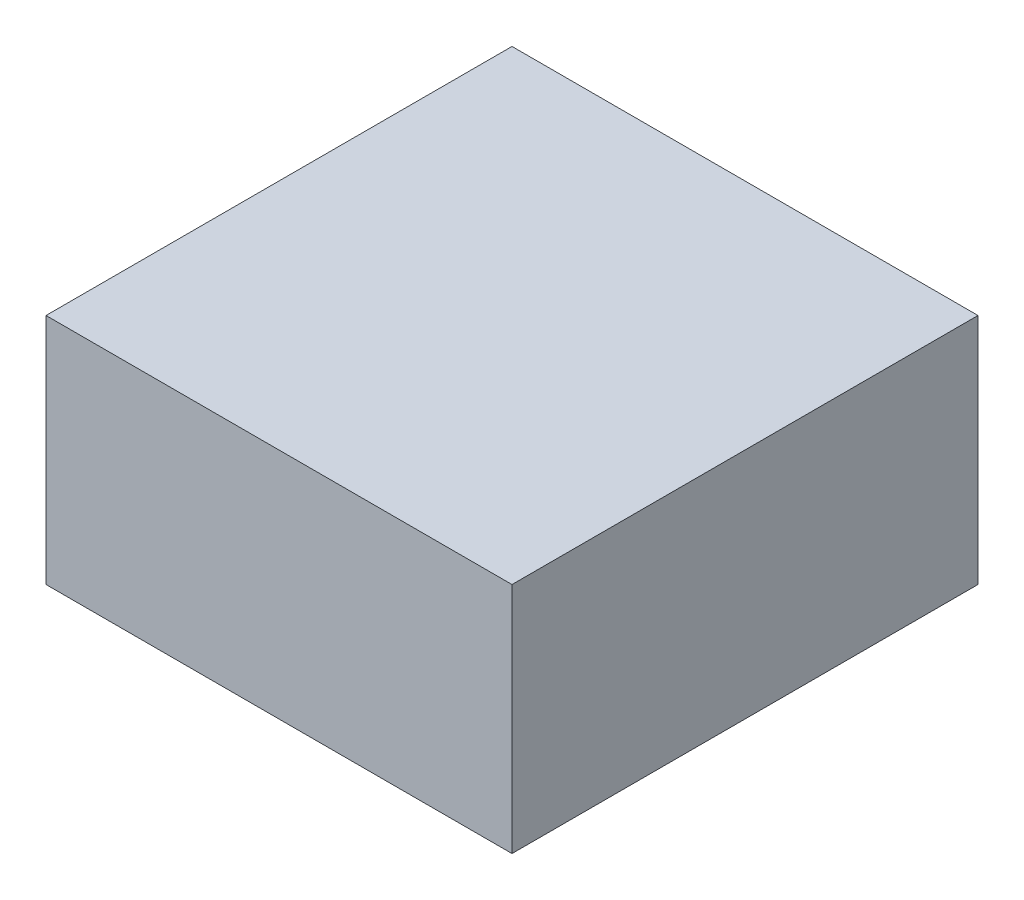
ISO-10303-21;
HEADER;
FILE_DESCRIPTION(('STEP AP214'),'2;1');
FILE_NAME('part.step','',(''),(''),'','','');
FILE_SCHEMA(('AUTOMOTIVE_DESIGN { 1 0 10303 214 1 1 1 1 }'));
ENDSEC;
DATA;
#1=APPLICATION_CONTEXT('core data for automotive mechanical design processes');
#2=APPLICATION_PROTOCOL_DEFINITION('international standard','automotive_design',2000,#1);
#3=PRODUCT_CONTEXT('',#1,'mechanical');
#4=PRODUCT('Part','Part','',(#3));
#5=PRODUCT_RELATED_PRODUCT_CATEGORY('part','',(#4));
#6=PRODUCT_DEFINITION_FORMATION('','',#4);
#7=PRODUCT_DEFINITION_CONTEXT('part definition',#1,'design');
#8=PRODUCT_DEFINITION('design','',#6,#7);
#9=PRODUCT_DEFINITION_SHAPE('','',#8);
#10=(LENGTH_UNIT() NAMED_UNIT(*) SI_UNIT(.MILLI.,.METRE.));
#11=(NAMED_UNIT(*) PLANE_ANGLE_UNIT() SI_UNIT($,.RADIAN.));
#12=(NAMED_UNIT(*) SI_UNIT($,.STERADIAN.) SOLID_ANGLE_UNIT());
#13=UNCERTAINTY_MEASURE_WITH_UNIT(LENGTH_MEASURE(1.E-05),#10,'distance_accuracy_value','');
#14=(GEOMETRIC_REPRESENTATION_CONTEXT(3) GLOBAL_UNCERTAINTY_ASSIGNED_CONTEXT((#13)) GLOBAL_UNIT_ASSIGNED_CONTEXT((#10,
#11,#12)) REPRESENTATION_CONTEXT('',''));
#15=CARTESIAN_POINT('',(0.,0.,0.));
#16=DIRECTION('',(0.,0.,1.));
#17=DIRECTION('',(1.,0.,0.));
#18=AXIS2_PLACEMENT_3D('',#15,#16,#17);
#19=CARTESIAN_POINT('',(-250.,250.,250.));
#20=DIRECTION('',(1.,0.,0.));
#21=DIRECTION('',(0.,0.,-1.));
#22=AXIS2_PLACEMENT_3D('',#19,#20,#21);
#23=PLANE('',#22);
#24=DIRECTION('',(0.,0.,1.));
#25=VECTOR('',#24,1.);
#26=CARTESIAN_POINT('',(-250.,0.,250.));
#27=LINE('',#26,#25);
#28=CARTESIAN_POINT('',(-250.,0.,-250.));
#29=VERTEX_POINT('',#28);
#30=CARTESIAN_POINT('',(-250.,0.,250.));
#31=VERTEX_POINT('',#30);
#32=EDGE_CURVE('E111',#29,#31,#27,.T.);
#33=ORIENTED_EDGE('',*,*,#32,.T.);
#34=DIRECTION('',(0.,-1.,0.));
#35=VECTOR('',#34,1.);
#36=CARTESIAN_POINT('',(-250.,250.,250.));
#37=LINE('',#36,#35);
#38=CARTESIAN_POINT('',(-250.,250.,250.));
#39=VERTEX_POINT('',#38);
#40=EDGE_CURVE('E11',#39,#31,#37,.T.);
#41=ORIENTED_EDGE('',*,*,#40,.F.);
#42=DIRECTION('',(0.,0.,1.));
#43=VECTOR('',#42,1.);
#44=CARTESIAN_POINT('',(-250.,250.,250.));
#45=LINE('',#44,#43);
#46=CARTESIAN_POINT('',(-250.,250.,-250.));
#47=VERTEX_POINT('',#46);
#48=EDGE_CURVE('E95',#47,#39,#45,.T.);
#49=ORIENTED_EDGE('',*,*,#48,.F.);
#50=DIRECTION('',(0.,-1.,0.));
#51=VECTOR('',#50,1.);
#52=CARTESIAN_POINT('',(-250.,250.,-250.));
#53=LINE('',#52,#51);
#54=EDGE_CURVE('E107',#47,#29,#53,.T.);
#55=ORIENTED_EDGE('',*,*,#54,.T.);
#56=EDGE_LOOP('',(#33,#41,#49,#55));
#57=FACE_BOUND('',#56,.T.);
#58=ADVANCED_FACE('F43',(#57),#23,.F.);
#59=CARTESIAN_POINT('',(250.,250.,250.));
#60=DIRECTION('',(0.,0.,-1.));
#61=DIRECTION('',(-1.,0.,0.));
#62=AXIS2_PLACEMENT_3D('',#59,#60,#61);
#63=PLANE('',#62);
#64=DIRECTION('',(1.,0.,0.));
#65=VECTOR('',#64,1.);
#66=CARTESIAN_POINT('',(250.,0.,250.));
#67=LINE('',#66,#65);
#68=CARTESIAN_POINT('',(250.,0.,250.));
#69=VERTEX_POINT('',#68);
#70=EDGE_CURVE('E100',#31,#69,#67,.T.);
#71=ORIENTED_EDGE('',*,*,#70,.T.);
#72=DIRECTION('',(0.,-1.,0.));
#73=VECTOR('',#72,1.);
#74=CARTESIAN_POINT('',(250.,250.,250.));
#75=LINE('',#74,#73);
#76=CARTESIAN_POINT('',(250.,250.,250.));
#77=VERTEX_POINT('',#76);
#78=EDGE_CURVE('E52',#77,#69,#75,.T.);
#79=ORIENTED_EDGE('',*,*,#78,.F.);
#80=DIRECTION('',(1.,0.,0.));
#81=VECTOR('',#80,1.);
#82=CARTESIAN_POINT('',(250.,250.,250.));
#83=LINE('',#82,#81);
#84=EDGE_CURVE('E90',#39,#77,#83,.T.);
#85=ORIENTED_EDGE('',*,*,#84,.F.);
#86=ORIENTED_EDGE('',*,*,#40,.T.);
#87=EDGE_LOOP('',(#71,#79,#85,#86));
#88=FACE_BOUND('',#87,.T.);
#89=ADVANCED_FACE('F99',(#88),#63,.F.);
#90=CARTESIAN_POINT('',(250.,250.,250.));
#91=DIRECTION('',(-1.,0.,0.));
#92=DIRECTION('',(0.,0.,1.));
#93=AXIS2_PLACEMENT_3D('',#90,#91,#92);
#94=PLANE('',#93);
#95=DIRECTION('',(0.,0.,-1.));
#96=VECTOR('',#95,1.);
#97=CARTESIAN_POINT('',(250.,0.,250.));
#98=LINE('',#97,#96);
#99=CARTESIAN_POINT('',(250.,0.,-250.));
#100=VERTEX_POINT('',#99);
#101=EDGE_CURVE('E77',#69,#100,#98,.T.);
#102=ORIENTED_EDGE('',*,*,#101,.T.);
#103=DIRECTION('',(0.,-1.,0.));
#104=VECTOR('',#103,1.);
#105=CARTESIAN_POINT('',(250.,250.,-250.));
#106=LINE('',#105,#104);
#107=CARTESIAN_POINT('',(250.,250.,-250.));
#108=VERTEX_POINT('',#107);
#109=EDGE_CURVE('E102',#108,#100,#106,.T.);
#110=ORIENTED_EDGE('',*,*,#109,.F.);
#111=DIRECTION('',(0.,0.,-1.));
#112=VECTOR('',#111,1.);
#113=CARTESIAN_POINT('',(250.,250.,250.));
#114=LINE('',#113,#112);
#115=EDGE_CURVE('E93',#77,#108,#114,.T.);
#116=ORIENTED_EDGE('',*,*,#115,.F.);
#117=ORIENTED_EDGE('',*,*,#78,.T.);
#118=EDGE_LOOP('',(#102,#110,#116,#117));
#119=FACE_BOUND('',#118,.T.);
#120=ADVANCED_FACE('F103',(#119),#94,.F.);
#121=CARTESIAN_POINT('',(250.,250.,-250.));
#122=DIRECTION('',(0.,0.,1.));
#123=DIRECTION('',(1.,0.,0.));
#124=AXIS2_PLACEMENT_3D('',#121,#122,#123);
#125=PLANE('',#124);
#126=DIRECTION('',(-1.,0.,0.));
#127=VECTOR('',#126,1.);
#128=CARTESIAN_POINT('',(250.,0.,-250.));
#129=LINE('',#128,#127);
#130=EDGE_CURVE('E83',#100,#29,#129,.T.);
#131=ORIENTED_EDGE('',*,*,#130,.T.);
#132=ORIENTED_EDGE('',*,*,#54,.F.);
#133=DIRECTION('',(-1.,0.,0.));
#134=VECTOR('',#133,1.);
#135=CARTESIAN_POINT('',(250.,250.,-250.));
#136=LINE('',#135,#134);
#137=EDGE_CURVE('E60',#108,#47,#136,.T.);
#138=ORIENTED_EDGE('',*,*,#137,.F.);
#139=ORIENTED_EDGE('',*,*,#109,.T.);
#140=EDGE_LOOP('',(#131,#132,#138,#139));
#141=FACE_BOUND('',#140,.T.);
#142=ADVANCED_FACE('F124',(#141),#125,.F.);
#143=CARTESIAN_POINT('',(0.,250.,0.));
#144=DIRECTION('',(0.,1.,0.));
#145=DIRECTION('',(0.,0.,1.));
#146=AXIS2_PLACEMENT_3D('',#143,#144,#145);
#147=PLANE('',#146);
#148=ORIENTED_EDGE('',*,*,#48,.T.);
#149=ORIENTED_EDGE('',*,*,#84,.T.);
#150=ORIENTED_EDGE('',*,*,#115,.T.);
#151=ORIENTED_EDGE('',*,*,#137,.T.);
#152=EDGE_LOOP('',(#148,#149,#150,#151));
#153=FACE_BOUND('',#152,.T.);
#154=ADVANCED_FACE('F91',(#153),#147,.T.);
#155=CARTESIAN_POINT('',(0.,0.,0.));
#156=DIRECTION('',(0.,1.,0.));
#157=DIRECTION('',(0.,0.,1.));
#158=AXIS2_PLACEMENT_3D('',#155,#156,#157);
#159=PLANE('',#158);
#160=ORIENTED_EDGE('',*,*,#32,.F.);
#161=ORIENTED_EDGE('',*,*,#130,.F.);
#162=ORIENTED_EDGE('',*,*,#101,.F.);
#163=ORIENTED_EDGE('',*,*,#70,.F.);
#164=EDGE_LOOP('',(#160,#161,#162,#163));
#165=FACE_BOUND('',#164,.T.);
#166=ADVANCED_FACE('F127',(#165),#159,.F.);
#167=CLOSED_SHELL('',(#58,#89,#120,#142,#154,#166));
#168=MANIFOLD_SOLID_BREP('B2',#167);
#169=ADVANCED_BREP_SHAPE_REPRESENTATION('',(#18,#168),#14);
#170=SHAPE_DEFINITION_REPRESENTATION(#9,#169);
ENDSEC;
END-ISO-10303-21;
